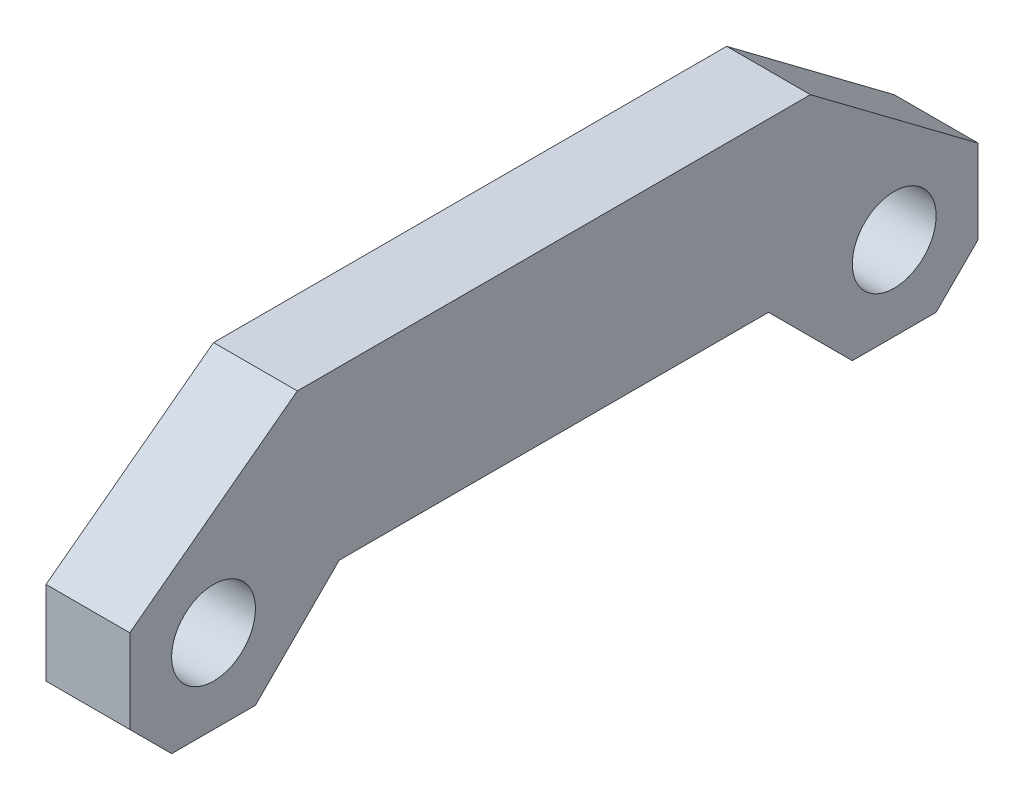
ISO-10303-21;
HEADER;
FILE_DESCRIPTION(('STEP AP214'),'2;1');
FILE_NAME('part.step','',(''),(''),'','','');
FILE_SCHEMA(('AUTOMOTIVE_DESIGN { 1 0 10303 214 1 1 1 1 }'));
ENDSEC;
DATA;
#1=APPLICATION_CONTEXT('core data for automotive mechanical design processes');
#2=APPLICATION_PROTOCOL_DEFINITION('international standard','automotive_design',2000,#1);
#3=PRODUCT_CONTEXT('',#1,'mechanical');
#4=PRODUCT('Part','Part','',(#3));
#5=PRODUCT_RELATED_PRODUCT_CATEGORY('part','',(#4));
#6=PRODUCT_DEFINITION_FORMATION('','',#4);
#7=PRODUCT_DEFINITION_CONTEXT('part definition',#1,'design');
#8=PRODUCT_DEFINITION('design','',#6,#7);
#9=PRODUCT_DEFINITION_SHAPE('','',#8);
#10=(LENGTH_UNIT() NAMED_UNIT(*) SI_UNIT(.MILLI.,.METRE.));
#11=(NAMED_UNIT(*) PLANE_ANGLE_UNIT() SI_UNIT($,.RADIAN.));
#12=(NAMED_UNIT(*) SI_UNIT($,.STERADIAN.) SOLID_ANGLE_UNIT());
#13=UNCERTAINTY_MEASURE_WITH_UNIT(LENGTH_MEASURE(1.E-05),#10,'distance_accuracy_value','');
#14=(GEOMETRIC_REPRESENTATION_CONTEXT(3) GLOBAL_UNCERTAINTY_ASSIGNED_CONTEXT((#13)) GLOBAL_UNIT_ASSIGNED_CONTEXT((#10,
#11,#12)) REPRESENTATION_CONTEXT('',''));
#15=CARTESIAN_POINT('',(0.,0.,0.));
#16=DIRECTION('',(0.,0.,1.));
#17=DIRECTION('',(1.,0.,0.));
#18=AXIS2_PLACEMENT_3D('',#15,#16,#17);
#19=CARTESIAN_POINT('',(12.7,-25.4,128.5875));
#20=DIRECTION('',(0.,1.,0.));
#21=DIRECTION('',(0.,0.,1.));
#22=AXIS2_PLACEMENT_3D('',#19,#20,#21);
#23=PLANE('',#22);
#24=DIRECTION('',(0.,0.,-1.));
#25=VECTOR('',#24,1.);
#26=CARTESIAN_POINT('',(12.7,-25.4,128.5875));
#27=LINE('',#26,#25);
#28=CARTESIAN_POINT('',(12.7,-25.4,115.8875));
#29=VERTEX_POINT('',#28);
#30=CARTESIAN_POINT('',(12.7,-25.4,90.4875));
#31=VERTEX_POINT('',#30);
#32=EDGE_CURVE('E157',#29,#31,#27,.T.);
#33=ORIENTED_EDGE('',*,*,#32,.F.);
#34=DIRECTION('',(1.,0.,0.));
#35=VECTOR('',#34,1.);
#36=CARTESIAN_POINT('',(-12.701,-25.4,115.8875));
#37=LINE('',#36,#35);
#38=CARTESIAN_POINT('',(-12.7,-25.4,115.8875));
#39=VERTEX_POINT('',#38);
#40=EDGE_CURVE('E278',#39,#29,#37,.T.);
#41=ORIENTED_EDGE('',*,*,#40,.F.);
#42=DIRECTION('',(0.,0.,-1.));
#43=VECTOR('',#42,1.);
#44=CARTESIAN_POINT('',(-12.7,-25.4,128.5875));
#45=LINE('',#44,#43);
#46=CARTESIAN_POINT('',(-12.7,-25.4,90.4875));
#47=VERTEX_POINT('',#46);
#48=EDGE_CURVE('E142',#39,#47,#45,.T.);
#49=ORIENTED_EDGE('',*,*,#48,.T.);
#50=DIRECTION('',(1.,0.,0.));
#51=VECTOR('',#50,1.);
#52=CARTESIAN_POINT('',(-12.701,-25.4,90.4875));
#53=LINE('',#52,#51);
#54=EDGE_CURVE('E205',#47,#31,#53,.T.);
#55=ORIENTED_EDGE('',*,*,#54,.T.);
#56=EDGE_LOOP('',(#33,#41,#49,#55));
#57=FACE_BOUND('',#56,.T.);
#58=ADVANCED_FACE('F33',(#57),#23,.F.);
#59=CARTESIAN_POINT('',(12.7,-25.4,128.5875));
#60=DIRECTION('',(1.,0.,0.));
#61=DIRECTION('',(0.,0.,-1.));
#62=AXIS2_PLACEMENT_3D('',#59,#60,#61);
#63=PLANE('',#62);
#64=DIRECTION('',(0.,-0.707106781186549,0.707106781186546));
#65=VECTOR('',#64,1.);
#66=CARTESIAN_POINT('',(12.7,-25.4,-115.8875));
#67=LINE('',#66,#65);
#68=CARTESIAN_POINT('',(12.7,-12.7,-128.5875));
#69=VERTEX_POINT('',#68);
#70=CARTESIAN_POINT('',(12.7,-25.4,-115.8875));
#71=VERTEX_POINT('',#70);
#72=EDGE_CURVE('E122',#69,#71,#67,.T.);
#73=ORIENTED_EDGE('',*,*,#72,.F.);
#74=DIRECTION('',(0.,1.,0.));
#75=VECTOR('',#74,1.);
#76=CARTESIAN_POINT('',(12.7,50.8,-128.5875));
#77=LINE('',#76,#75);
#78=CARTESIAN_POINT('',(12.7,12.7,-128.5875));
#79=VERTEX_POINT('',#78);
#80=EDGE_CURVE('E41',#69,#79,#77,.T.);
#81=ORIENTED_EDGE('',*,*,#80,.T.);
#82=DIRECTION('',(0.,-0.6,-0.8));
#83=VECTOR('',#82,1.);
#84=CARTESIAN_POINT('',(12.7,12.7,-128.5875));
#85=LINE('',#84,#83);
#86=CARTESIAN_POINT('',(12.7,50.8,-77.7875));
#87=VERTEX_POINT('',#86);
#88=EDGE_CURVE('E164',#87,#79,#85,.T.);
#89=ORIENTED_EDGE('',*,*,#88,.F.);
#90=DIRECTION('',(0.,0.,1.));
#91=VECTOR('',#90,1.);
#92=CARTESIAN_POINT('',(12.7,50.8,128.5875));
#93=LINE('',#92,#91);
#94=CARTESIAN_POINT('',(12.7,50.8,77.7875));
#95=VERTEX_POINT('',#94);
#96=EDGE_CURVE('E11',#87,#95,#93,.T.);
#97=ORIENTED_EDGE('',*,*,#96,.T.);
#98=DIRECTION('',(0.,0.6,-0.8));
#99=VECTOR('',#98,1.);
#100=CARTESIAN_POINT('',(12.7,12.7,128.5875));
#101=LINE('',#100,#99);
#102=CARTESIAN_POINT('',(12.7,12.7,128.5875));
#103=VERTEX_POINT('',#102);
#104=EDGE_CURVE('E182',#103,#95,#101,.T.);
#105=ORIENTED_EDGE('',*,*,#104,.F.);
#106=DIRECTION('',(0.,-1.,0.));
#107=VECTOR('',#106,1.);
#108=CARTESIAN_POINT('',(12.7,50.8,128.5875));
#109=LINE('',#108,#107);
#110=CARTESIAN_POINT('',(12.7,-12.7,128.5875));
#111=VERTEX_POINT('',#110);
#112=EDGE_CURVE('E153',#103,#111,#109,.T.);
#113=ORIENTED_EDGE('',*,*,#112,.T.);
#114=DIRECTION('',(0.,0.707106781186549,0.707106781186546));
#115=VECTOR('',#114,1.);
#116=CARTESIAN_POINT('',(12.7,-12.7,128.5875));
#117=LINE('',#116,#115);
#118=EDGE_CURVE('E56',#29,#111,#117,.T.);
#119=ORIENTED_EDGE('',*,*,#118,.F.);
#120=ORIENTED_EDGE('',*,*,#32,.T.);
#121=DIRECTION('',(0.,-0.707106781186547,0.707106781186548));
#122=VECTOR('',#121,1.);
#123=CARTESIAN_POINT('',(12.7,-25.4,90.4875));
#124=LINE('',#123,#122);
#125=CARTESIAN_POINT('',(12.7,0.,65.0875));
#126=VERTEX_POINT('',#125);
#127=EDGE_CURVE('E202',#126,#31,#124,.T.);
#128=ORIENTED_EDGE('',*,*,#127,.F.);
#129=DIRECTION('',(0.,0.,1.));
#130=VECTOR('',#129,1.);
#131=CARTESIAN_POINT('',(12.7,0.,65.0875));
#132=LINE('',#131,#130);
#133=CARTESIAN_POINT('',(12.7,0.,-65.0875));
#134=VERTEX_POINT('',#133);
#135=EDGE_CURVE('E199',#134,#126,#132,.T.);
#136=ORIENTED_EDGE('',*,*,#135,.F.);
#137=DIRECTION('',(0.,0.707106781186547,0.707106781186548));
#138=VECTOR('',#137,1.);
#139=CARTESIAN_POINT('',(12.7,0.,-65.0875));
#140=LINE('',#139,#138);
#141=CARTESIAN_POINT('',(12.7,-25.4,-90.4875));
#142=VERTEX_POINT('',#141);
#143=EDGE_CURVE('E196',#142,#134,#140,.T.);
#144=ORIENTED_EDGE('',*,*,#143,.F.);
#145=EDGE_CURVE('E156',#142,#71,#27,.T.);
#146=ORIENTED_EDGE('',*,*,#145,.T.);
#147=EDGE_LOOP('',(#73,#81,#89,#97,#105,#113,#119,#120,#128,#136,#144,#146));
#148=FACE_BOUND('',#147,.T.);
#149=CARTESIAN_POINT('',(12.7,0.,103.1875));
#150=DIRECTION('',(1.,0.,0.));
#151=DIRECTION('',(0.,0.,-1.));
#152=AXIS2_PLACEMENT_3D('',#149,#150,#151);
#153=CIRCLE('',#152,12.7);
#154=CARTESIAN_POINT('',(12.7,0.,90.4875));
#155=VERTEX_POINT('',#154);
#156=EDGE_CURVE('E146',#155,#155,#153,.T.);
#157=ORIENTED_EDGE('',*,*,#156,.F.);
#158=EDGE_LOOP('',(#157));
#159=FACE_BOUND('',#158,.T.);
#160=CARTESIAN_POINT('',(12.7,0.,-103.1875));
#161=DIRECTION('',(1.,0.,0.));
#162=DIRECTION('',(0.,0.,-1.));
#163=AXIS2_PLACEMENT_3D('',#160,#161,#162);
#164=CIRCLE('',#163,12.7);
#165=CARTESIAN_POINT('',(12.7,0.,-115.8875));
#166=VERTEX_POINT('',#165);
#167=EDGE_CURVE('E218',#166,#166,#164,.T.);
#168=ORIENTED_EDGE('',*,*,#167,.F.);
#169=EDGE_LOOP('',(#168));
#170=FACE_BOUND('',#169,.T.);
#171=ADVANCED_FACE('F162',(#148,#159,#170),#63,.T.);
#172=CARTESIAN_POINT('',(-12.7,-25.4,128.5875));
#173=DIRECTION('',(1.,0.,0.));
#174=DIRECTION('',(0.,0.,-1.));
#175=AXIS2_PLACEMENT_3D('',#172,#173,#174);
#176=PLANE('',#175);
#177=CARTESIAN_POINT('',(-12.7,0.,103.1875));
#178=DIRECTION('',(1.,0.,0.));
#179=DIRECTION('',(0.,0.,-1.));
#180=AXIS2_PLACEMENT_3D('',#177,#178,#179);
#181=CIRCLE('',#180,12.7);
#182=CARTESIAN_POINT('',(-12.7,0.,90.4875));
#183=VERTEX_POINT('',#182);
#184=EDGE_CURVE('E221',#183,#183,#181,.T.);
#185=ORIENTED_EDGE('',*,*,#184,.T.);
#186=EDGE_LOOP('',(#185));
#187=FACE_BOUND('',#186,.T.);
#188=DIRECTION('',(0.,1.,0.));
#189=VECTOR('',#188,1.);
#190=CARTESIAN_POINT('',(-12.7,50.8,-128.5875));
#191=LINE('',#190,#189);
#192=CARTESIAN_POINT('',(-12.7,-12.6999999999999,-128.5875));
#193=VERTEX_POINT('',#192);
#194=CARTESIAN_POINT('',(-12.7,12.7,-128.5875));
#195=VERTEX_POINT('',#194);
#196=EDGE_CURVE('E137',#193,#195,#191,.T.);
#197=ORIENTED_EDGE('',*,*,#196,.F.);
#198=DIRECTION('',(0.,0.707106781186549,-0.707106781186546));
#199=VECTOR('',#198,1.);
#200=CARTESIAN_POINT('',(-12.7,-25.4,-115.8875));
#201=LINE('',#200,#199);
#202=CARTESIAN_POINT('',(-12.7,-25.4,-115.8875));
#203=VERTEX_POINT('',#202);
#204=EDGE_CURVE('E48',#203,#193,#201,.T.);
#205=ORIENTED_EDGE('',*,*,#204,.F.);
#206=CARTESIAN_POINT('',(-12.7,-25.4,-90.4875));
#207=VERTEX_POINT('',#206);
#208=EDGE_CURVE('E135',#207,#203,#45,.T.);
#209=ORIENTED_EDGE('',*,*,#208,.F.);
#210=DIRECTION('',(0.,-0.707106781186547,-0.707106781186548));
#211=VECTOR('',#210,1.);
#212=CARTESIAN_POINT('',(-12.7,0.,-65.0875));
#213=LINE('',#212,#211);
#214=CARTESIAN_POINT('',(-12.7,0.,-65.0875));
#215=VERTEX_POINT('',#214);
#216=EDGE_CURVE('E208',#215,#207,#213,.T.);
#217=ORIENTED_EDGE('',*,*,#216,.F.);
#218=DIRECTION('',(0.,0.,-1.));
#219=VECTOR('',#218,1.);
#220=CARTESIAN_POINT('',(-12.7,0.,65.0875));
#221=LINE('',#220,#219);
#222=CARTESIAN_POINT('',(-12.7,0.,65.0875));
#223=VERTEX_POINT('',#222);
#224=EDGE_CURVE('E189',#223,#215,#221,.T.);
#225=ORIENTED_EDGE('',*,*,#224,.F.);
#226=DIRECTION('',(0.,0.707106781186547,-0.707106781186548));
#227=VECTOR('',#226,1.);
#228=CARTESIAN_POINT('',(-12.7,-25.4,90.4875));
#229=LINE('',#228,#227);
#230=EDGE_CURVE('E193',#47,#223,#229,.T.);
#231=ORIENTED_EDGE('',*,*,#230,.F.);
#232=ORIENTED_EDGE('',*,*,#48,.F.);
#233=DIRECTION('',(0.,-0.707106781186549,-0.707106781186546));
#234=VECTOR('',#233,1.);
#235=CARTESIAN_POINT('',(-12.7,-12.7,128.5875));
#236=LINE('',#235,#234);
#237=CARTESIAN_POINT('',(-12.7,-12.7,128.5875));
#238=VERTEX_POINT('',#237);
#239=EDGE_CURVE('E272',#238,#39,#236,.T.);
#240=ORIENTED_EDGE('',*,*,#239,.F.);
#241=DIRECTION('',(0.,-1.,0.));
#242=VECTOR('',#241,1.);
#243=CARTESIAN_POINT('',(-12.7,50.8,128.5875));
#244=LINE('',#243,#242);
#245=CARTESIAN_POINT('',(-12.7,12.7,128.5875));
#246=VERTEX_POINT('',#245);
#247=EDGE_CURVE('E143',#246,#238,#244,.T.);
#248=ORIENTED_EDGE('',*,*,#247,.F.);
#249=DIRECTION('',(0.,-0.6,0.8));
#250=VECTOR('',#249,1.);
#251=CARTESIAN_POINT('',(-12.7,12.7,128.5875));
#252=LINE('',#251,#250);
#253=CARTESIAN_POINT('',(-12.7,50.8,77.7875));
#254=VERTEX_POINT('',#253);
#255=EDGE_CURVE('E178',#254,#246,#252,.T.);
#256=ORIENTED_EDGE('',*,*,#255,.F.);
#257=DIRECTION('',(0.,0.,1.));
#258=VECTOR('',#257,1.);
#259=CARTESIAN_POINT('',(-12.7,50.8,128.5875));
#260=LINE('',#259,#258);
#261=CARTESIAN_POINT('',(-12.7,50.8,-77.7875));
#262=VERTEX_POINT('',#261);
#263=EDGE_CURVE('E151',#262,#254,#260,.T.);
#264=ORIENTED_EDGE('',*,*,#263,.F.);
#265=DIRECTION('',(0.,0.6,0.8));
#266=VECTOR('',#265,1.);
#267=CARTESIAN_POINT('',(-12.7,12.7,-128.5875));
#268=LINE('',#267,#266);
#269=EDGE_CURVE('E174',#195,#262,#268,.T.);
#270=ORIENTED_EDGE('',*,*,#269,.F.);
#271=EDGE_LOOP('',(#197,#205,#209,#217,#225,#231,#232,#240,#248,#256,#264,#270));
#272=FACE_BOUND('',#271,.T.);
#273=CARTESIAN_POINT('',(-12.7,0.,-103.1875));
#274=DIRECTION('',(1.,0.,0.));
#275=DIRECTION('',(0.,0.,-1.));
#276=AXIS2_PLACEMENT_3D('',#273,#274,#275);
#277=CIRCLE('',#276,12.7);
#278=CARTESIAN_POINT('',(-12.7,0.,-115.8875));
#279=VERTEX_POINT('',#278);
#280=EDGE_CURVE('E215',#279,#279,#277,.T.);
#281=ORIENTED_EDGE('',*,*,#280,.T.);
#282=EDGE_LOOP('',(#281));
#283=FACE_BOUND('',#282,.T.);
#284=ADVANCED_FACE('F132',(#187,#272,#283),#176,.F.);
#285=CARTESIAN_POINT('',(12.7,50.8,128.5875));
#286=DIRECTION('',(0.,0.,-1.));
#287=DIRECTION('',(0.,1.,0.));
#288=AXIS2_PLACEMENT_3D('',#285,#286,#287);
#289=PLANE('',#288);
#290=ORIENTED_EDGE('',*,*,#247,.T.);
#291=DIRECTION('',(1.,0.,0.));
#292=VECTOR('',#291,1.);
#293=CARTESIAN_POINT('',(-12.701,-12.7,128.5875));
#294=LINE('',#293,#292);
#295=EDGE_CURVE('E275',#238,#111,#294,.T.);
#296=ORIENTED_EDGE('',*,*,#295,.T.);
#297=ORIENTED_EDGE('',*,*,#112,.F.);
#298=DIRECTION('',(1.,0.,0.));
#299=VECTOR('',#298,1.);
#300=CARTESIAN_POINT('',(-12.701,12.7,128.5875));
#301=LINE('',#300,#299);
#302=EDGE_CURVE('E185',#246,#103,#301,.T.);
#303=ORIENTED_EDGE('',*,*,#302,.F.);
#304=EDGE_LOOP('',(#290,#296,#297,#303));
#305=FACE_BOUND('',#304,.T.);
#306=ADVANCED_FACE('F35',(#305),#289,.F.);
#307=ORIENTED_EDGE('',*,*,#208,.T.);
#308=DIRECTION('',(1.,0.,0.));
#309=VECTOR('',#308,1.);
#310=CARTESIAN_POINT('',(-12.701,-25.4,-115.8875));
#311=LINE('',#310,#309);
#312=EDGE_CURVE('E119',#203,#71,#311,.T.);
#313=ORIENTED_EDGE('',*,*,#312,.T.);
#314=ORIENTED_EDGE('',*,*,#145,.F.);
#315=DIRECTION('',(1.,0.,0.));
#316=VECTOR('',#315,1.);
#317=CARTESIAN_POINT('',(-12.701,-25.4,-90.4875));
#318=LINE('',#317,#316);
#319=EDGE_CURVE('E141',#207,#142,#318,.T.);
#320=ORIENTED_EDGE('',*,*,#319,.F.);
#321=EDGE_LOOP('',(#307,#313,#314,#320));
#322=FACE_BOUND('',#321,.T.);
#323=ADVANCED_FACE('F140',(#322),#23,.F.);
#324=CARTESIAN_POINT('',(12.7,50.8,-128.5875));
#325=DIRECTION('',(0.,0.,1.));
#326=DIRECTION('',(0.,-1.,0.));
#327=AXIS2_PLACEMENT_3D('',#324,#325,#326);
#328=PLANE('',#327);
#329=ORIENTED_EDGE('',*,*,#80,.F.);
#330=DIRECTION('',(1.,0.,0.));
#331=VECTOR('',#330,1.);
#332=CARTESIAN_POINT('',(-12.701,-12.7,-128.5875));
#333=LINE('',#332,#331);
#334=EDGE_CURVE('E127',#193,#69,#333,.T.);
#335=ORIENTED_EDGE('',*,*,#334,.F.);
#336=ORIENTED_EDGE('',*,*,#196,.T.);
#337=DIRECTION('',(1.,0.,0.));
#338=VECTOR('',#337,1.);
#339=CARTESIAN_POINT('',(-12.701,12.7,-128.5875));
#340=LINE('',#339,#338);
#341=EDGE_CURVE('E171',#195,#79,#340,.T.);
#342=ORIENTED_EDGE('',*,*,#341,.T.);
#343=EDGE_LOOP('',(#329,#335,#336,#342));
#344=FACE_BOUND('',#343,.T.);
#345=ADVANCED_FACE('F176',(#344),#328,.F.);
#346=CARTESIAN_POINT('',(12.7,50.8,128.5875));
#347=DIRECTION('',(0.,-1.,0.));
#348=DIRECTION('',(0.,0.,-1.));
#349=AXIS2_PLACEMENT_3D('',#346,#347,#348);
#350=PLANE('',#349);
#351=ORIENTED_EDGE('',*,*,#96,.F.);
#352=DIRECTION('',(1.,0.,0.));
#353=VECTOR('',#352,1.);
#354=CARTESIAN_POINT('',(-12.701,50.8,-77.7875));
#355=LINE('',#354,#353);
#356=EDGE_CURVE('E173',#262,#87,#355,.T.);
#357=ORIENTED_EDGE('',*,*,#356,.F.);
#358=ORIENTED_EDGE('',*,*,#263,.T.);
#359=DIRECTION('',(1.,0.,0.));
#360=VECTOR('',#359,1.);
#361=CARTESIAN_POINT('',(-12.701,50.8,77.7875));
#362=LINE('',#361,#360);
#363=EDGE_CURVE('E186',#254,#95,#362,.T.);
#364=ORIENTED_EDGE('',*,*,#363,.T.);
#365=EDGE_LOOP('',(#351,#357,#358,#364));
#366=FACE_BOUND('',#365,.T.);
#367=ADVANCED_FACE('F254',(#366),#350,.F.);
#368=CARTESIAN_POINT('',(12.7,0.,103.1875));
#369=DIRECTION('',(-1.,0.,0.));
#370=DIRECTION('',(0.,0.,1.));
#371=AXIS2_PLACEMENT_3D('',#368,#369,#370);
#372=CYLINDRICAL_SURFACE('',#371,12.7);
#373=ORIENTED_EDGE('',*,*,#156,.T.);
#374=EDGE_LOOP('',(#373));
#375=FACE_BOUND('',#374,.T.);
#376=ORIENTED_EDGE('',*,*,#184,.F.);
#377=EDGE_LOOP('',(#376));
#378=FACE_BOUND('',#377,.T.);
#379=ADVANCED_FACE('F226',(#375,#378),#372,.F.);
#380=CARTESIAN_POINT('',(12.7,0.,-103.1875));
#381=DIRECTION('',(-1.,0.,0.));
#382=DIRECTION('',(0.,0.,1.));
#383=AXIS2_PLACEMENT_3D('',#380,#381,#382);
#384=CYLINDRICAL_SURFACE('',#383,12.7);
#385=ORIENTED_EDGE('',*,*,#167,.T.);
#386=EDGE_LOOP('',(#385));
#387=FACE_BOUND('',#386,.T.);
#388=ORIENTED_EDGE('',*,*,#280,.F.);
#389=EDGE_LOOP('',(#388));
#390=FACE_BOUND('',#389,.T.);
#391=ADVANCED_FACE('F233',(#387,#390),#384,.F.);
#392=CARTESIAN_POINT('',(-12.701,-25.4,90.4875));
#393=DIRECTION('',(0.,0.707106781186548,0.707106781186547));
#394=DIRECTION('',(0.,-0.707106781186547,0.707106781186548));
#395=AXIS2_PLACEMENT_3D('',#392,#393,#394);
#396=PLANE('',#395);
#397=ORIENTED_EDGE('',*,*,#230,.T.);
#398=DIRECTION('',(1.,0.,0.));
#399=VECTOR('',#398,1.);
#400=CARTESIAN_POINT('',(-12.701,0.,65.0875));
#401=LINE('',#400,#399);
#402=EDGE_CURVE('E209',#223,#126,#401,.T.);
#403=ORIENTED_EDGE('',*,*,#402,.T.);
#404=ORIENTED_EDGE('',*,*,#127,.T.);
#405=ORIENTED_EDGE('',*,*,#54,.F.);
#406=EDGE_LOOP('',(#397,#403,#404,#405));
#407=FACE_BOUND('',#406,.T.);
#408=ADVANCED_FACE('F236',(#407),#396,.F.);
#409=CARTESIAN_POINT('',(-12.701,0.,65.0875));
#410=DIRECTION('',(0.,1.,0.));
#411=DIRECTION('',(0.,0.,1.));
#412=AXIS2_PLACEMENT_3D('',#409,#410,#411);
#413=PLANE('',#412);
#414=ORIENTED_EDGE('',*,*,#224,.T.);
#415=DIRECTION('',(1.,0.,0.));
#416=VECTOR('',#415,1.);
#417=CARTESIAN_POINT('',(-12.701,0.,-65.0875));
#418=LINE('',#417,#416);
#419=EDGE_CURVE('E211',#215,#134,#418,.T.);
#420=ORIENTED_EDGE('',*,*,#419,.T.);
#421=ORIENTED_EDGE('',*,*,#135,.T.);
#422=ORIENTED_EDGE('',*,*,#402,.F.);
#423=EDGE_LOOP('',(#414,#420,#421,#422));
#424=FACE_BOUND('',#423,.T.);
#425=ADVANCED_FACE('F290',(#424),#413,.F.);
#426=CARTESIAN_POINT('',(-12.701,0.,-65.0875));
#427=DIRECTION('',(0.,0.707106781186548,-0.707106781186547));
#428=DIRECTION('',(0.,0.707106781186547,0.707106781186548));
#429=AXIS2_PLACEMENT_3D('',#426,#427,#428);
#430=PLANE('',#429);
#431=ORIENTED_EDGE('',*,*,#216,.T.);
#432=ORIENTED_EDGE('',*,*,#319,.T.);
#433=ORIENTED_EDGE('',*,*,#143,.T.);
#434=ORIENTED_EDGE('',*,*,#419,.F.);
#435=EDGE_LOOP('',(#431,#432,#433,#434));
#436=FACE_BOUND('',#435,.T.);
#437=ADVANCED_FACE('F294',(#436),#430,.F.);
#438=CARTESIAN_POINT('',(-12.701,12.7,128.5875));
#439=DIRECTION('',(0.,-0.8,-0.6));
#440=DIRECTION('',(0.,0.6,-0.8));
#441=AXIS2_PLACEMENT_3D('',#438,#439,#440);
#442=PLANE('',#441);
#443=ORIENTED_EDGE('',*,*,#255,.T.);
#444=ORIENTED_EDGE('',*,*,#302,.T.);
#445=ORIENTED_EDGE('',*,*,#104,.T.);
#446=ORIENTED_EDGE('',*,*,#363,.F.);
#447=EDGE_LOOP('',(#443,#444,#445,#446));
#448=FACE_BOUND('',#447,.T.);
#449=ADVANCED_FACE('F266',(#448),#442,.F.);
#450=CARTESIAN_POINT('',(-12.701,12.7,-128.5875));
#451=DIRECTION('',(0.,-0.8,0.6));
#452=DIRECTION('',(0.,-0.6,-0.8));
#453=AXIS2_PLACEMENT_3D('',#450,#451,#452);
#454=PLANE('',#453);
#455=ORIENTED_EDGE('',*,*,#269,.T.);
#456=ORIENTED_EDGE('',*,*,#356,.T.);
#457=ORIENTED_EDGE('',*,*,#88,.T.);
#458=ORIENTED_EDGE('',*,*,#341,.F.);
#459=EDGE_LOOP('',(#455,#456,#457,#458));
#460=FACE_BOUND('',#459,.T.);
#461=ADVANCED_FACE('F170',(#460),#454,.F.);
#462=CARTESIAN_POINT('',(-12.701,-12.7,128.5875));
#463=DIRECTION('',(0.,0.707106781186546,-0.707106781186549));
#464=DIRECTION('',(0.,0.707106781186549,0.707106781186546));
#465=AXIS2_PLACEMENT_3D('',#462,#463,#464);
#466=PLANE('',#465);
#467=ORIENTED_EDGE('',*,*,#239,.T.);
#468=ORIENTED_EDGE('',*,*,#40,.T.);
#469=ORIENTED_EDGE('',*,*,#118,.T.);
#470=ORIENTED_EDGE('',*,*,#295,.F.);
#471=EDGE_LOOP('',(#467,#468,#469,#470));
#472=FACE_BOUND('',#471,.T.);
#473=ADVANCED_FACE('F284',(#472),#466,.F.);
#474=CARTESIAN_POINT('',(-12.701,-25.4,-115.8875));
#475=DIRECTION('',(0.,0.707106781186546,0.707106781186549));
#476=DIRECTION('',(0.,-0.707106781186549,0.707106781186546));
#477=AXIS2_PLACEMENT_3D('',#474,#475,#476);
#478=PLANE('',#477);
#479=ORIENTED_EDGE('',*,*,#204,.T.);
#480=ORIENTED_EDGE('',*,*,#334,.T.);
#481=ORIENTED_EDGE('',*,*,#72,.T.);
#482=ORIENTED_EDGE('',*,*,#312,.F.);
#483=EDGE_LOOP('',(#479,#480,#481,#482));
#484=FACE_BOUND('',#483,.T.);
#485=ADVANCED_FACE('F120',(#484),#478,.F.);
#486=CLOSED_SHELL('',(#58,#171,#284,#306,#323,#345,#367,#379,#391,#408,#425,#437,#449,#461,#473,#485));
#487=MANIFOLD_SOLID_BREP('B2',#486);
#488=ADVANCED_BREP_SHAPE_REPRESENTATION('',(#18,#487),#14);
#489=SHAPE_DEFINITION_REPRESENTATION(#9,#488);
ENDSEC;
END-ISO-10303-21;
